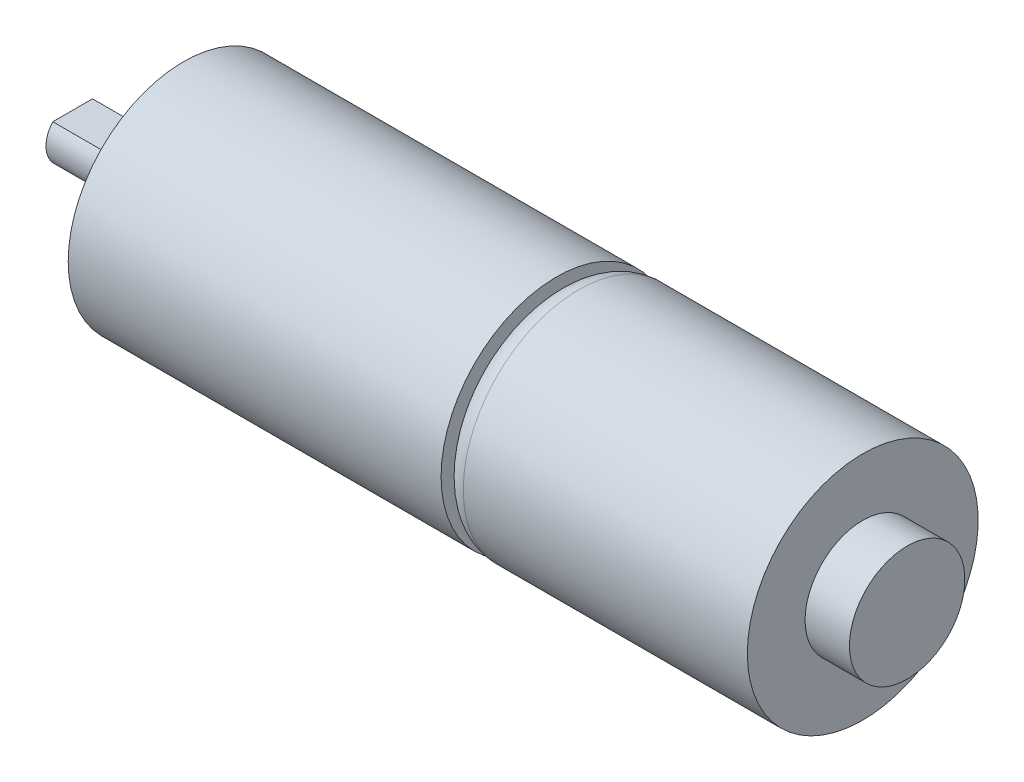
ISO-10303-21;
HEADER;
FILE_DESCRIPTION(('STEP AP214'),'2;1');
FILE_NAME('part.step','',(''),(''),'','','');
FILE_SCHEMA(('AUTOMOTIVE_DESIGN { 1 0 10303 214 1 1 1 1 }'));
ENDSEC;
DATA;
#1=APPLICATION_CONTEXT('core data for automotive mechanical design processes');
#2=APPLICATION_PROTOCOL_DEFINITION('international standard','automotive_design',2000,#1);
#3=PRODUCT_CONTEXT('',#1,'mechanical');
#4=PRODUCT('Part','Part','',(#3));
#5=PRODUCT_RELATED_PRODUCT_CATEGORY('part','',(#4));
#6=PRODUCT_DEFINITION_FORMATION('','',#4);
#7=PRODUCT_DEFINITION_CONTEXT('part definition',#1,'design');
#8=PRODUCT_DEFINITION('design','',#6,#7);
#9=PRODUCT_DEFINITION_SHAPE('','',#8);
#10=(LENGTH_UNIT() NAMED_UNIT(*) SI_UNIT(.MILLI.,.METRE.));
#11=(NAMED_UNIT(*) PLANE_ANGLE_UNIT() SI_UNIT($,.RADIAN.));
#12=(NAMED_UNIT(*) SI_UNIT($,.STERADIAN.) SOLID_ANGLE_UNIT());
#13=UNCERTAINTY_MEASURE_WITH_UNIT(LENGTH_MEASURE(1.E-05),#10,'distance_accuracy_value','');
#14=(GEOMETRIC_REPRESENTATION_CONTEXT(3) GLOBAL_UNCERTAINTY_ASSIGNED_CONTEXT((#13)) GLOBAL_UNIT_ASSIGNED_CONTEXT((#10,
#11,#12)) REPRESENTATION_CONTEXT('',''));
#15=CARTESIAN_POINT('',(0.,0.,0.));
#16=DIRECTION('',(0.,0.,1.));
#17=DIRECTION('',(1.,0.,0.));
#18=AXIS2_PLACEMENT_3D('',#15,#16,#17);
#19=CARTESIAN_POINT('',(-188.,0.,0.));
#20=DIRECTION('',(1.,0.,0.));
#21=DIRECTION('',(0.,0.,-1.));
#22=AXIS2_PLACEMENT_3D('',#19,#20,#21);
#23=PLANE('',#22);
#24=CARTESIAN_POINT('',(-188.,0.,0.));
#25=DIRECTION('',(-1.,0.,0.));
#26=DIRECTION('',(0.,0.,1.));
#27=AXIS2_PLACEMENT_3D('',#24,#25,#26);
#28=CIRCLE('',#27,6.);
#29=CARTESIAN_POINT('',(-188.,4.,-4.47213595499959));
#30=VERTEX_POINT('',#29);
#31=CARTESIAN_POINT('',(-188.,4.,4.47213595499957));
#32=VERTEX_POINT('',#31);
#33=EDGE_CURVE('E105',#30,#32,#28,.T.);
#34=ORIENTED_EDGE('',*,*,#33,.T.);
#35=DIRECTION('',(0.,0.,1.));
#36=VECTOR('',#35,1.);
#37=CARTESIAN_POINT('',(-188.,4.,-26.));
#38=LINE('',#37,#36);
#39=EDGE_CURVE('E52',#30,#32,#38,.T.);
#40=ORIENTED_EDGE('',*,*,#39,.F.);
#41=EDGE_LOOP('',(#34,#40));
#42=FACE_BOUND('',#41,.T.);
#43=ADVANCED_FACE('F31',(#42),#23,.F.);
#44=CARTESIAN_POINT('',(-188.,0.,0.));
#45=DIRECTION('',(-1.,0.,0.));
#46=DIRECTION('',(0.,0.,1.));
#47=AXIS2_PLACEMENT_3D('',#44,#45,#46);
#48=CYLINDRICAL_SURFACE('',#47,6.);
#49=CARTESIAN_POINT('',(-173.,0.,0.));
#50=DIRECTION('',(1.,0.,0.));
#51=DIRECTION('',(0.,0.,-1.));
#52=AXIS2_PLACEMENT_3D('',#49,#50,#51);
#53=CIRCLE('',#52,6.);
#54=CARTESIAN_POINT('',(-173.,4.,-4.47213595499958));
#55=VERTEX_POINT('',#54);
#56=CARTESIAN_POINT('',(-173.,4.,4.47213595499957));
#57=VERTEX_POINT('',#56);
#58=EDGE_CURVE('E39',#55,#57,#53,.T.);
#59=ORIENTED_EDGE('',*,*,#58,.T.);
#60=DIRECTION('',(-1.,0.,0.));
#61=VECTOR('',#60,1.);
#62=CARTESIAN_POINT('',(-188.,4.,4.47213595499958));
#63=LINE('',#62,#61);
#64=EDGE_CURVE('E11',#57,#32,#63,.T.);
#65=ORIENTED_EDGE('',*,*,#64,.T.);
#66=ORIENTED_EDGE('',*,*,#33,.F.);
#67=DIRECTION('',(-1.,0.,0.));
#68=VECTOR('',#67,1.);
#69=CARTESIAN_POINT('',(-188.,4.,-4.47213595499958));
#70=LINE('',#69,#68);
#71=EDGE_CURVE('E63',#30,#55,#70,.F.);
#72=ORIENTED_EDGE('',*,*,#71,.T.);
#73=EDGE_LOOP('',(#59,#65,#66,#72));
#74=FACE_BOUND('',#73,.T.);
#75=CARTESIAN_POINT('',(-166.,0.,0.));
#76=DIRECTION('',(-1.,0.,0.));
#77=DIRECTION('',(0.,0.,1.));
#78=AXIS2_PLACEMENT_3D('',#75,#76,#77);
#79=CIRCLE('',#78,6.);
#80=CARTESIAN_POINT('',(-166.,0.,6.));
#81=VERTEX_POINT('',#80);
#82=EDGE_CURVE('E102',#81,#81,#79,.T.);
#83=ORIENTED_EDGE('',*,*,#82,.T.);
#84=EDGE_LOOP('',(#83));
#85=FACE_BOUND('',#84,.T.);
#86=ADVANCED_FACE('F59',(#74,#85),#48,.T.);
#87=CARTESIAN_POINT('',(-166.,16.,0.));
#88=DIRECTION('',(1.,0.,0.));
#89=DIRECTION('',(0.,0.,-1.));
#90=AXIS2_PLACEMENT_3D('',#87,#88,#89);
#91=PLANE('',#90);
#92=ORIENTED_EDGE('',*,*,#82,.F.);
#93=EDGE_LOOP('',(#92));
#94=FACE_BOUND('',#93,.T.);
#95=CARTESIAN_POINT('',(-166.,0.,0.));
#96=DIRECTION('',(-1.,0.,0.));
#97=DIRECTION('',(0.,0.,1.));
#98=AXIS2_PLACEMENT_3D('',#95,#96,#97);
#99=CIRCLE('',#98,16.);
#100=CARTESIAN_POINT('',(-166.,0.,16.));
#101=VERTEX_POINT('',#100);
#102=EDGE_CURVE('E99',#101,#101,#99,.T.);
#103=ORIENTED_EDGE('',*,*,#102,.T.);
#104=EDGE_LOOP('',(#103));
#105=FACE_BOUND('',#104,.T.);
#106=ADVANCED_FACE('F200',(#94,#105),#91,.F.);
#107=CARTESIAN_POINT('',(-188.,0.,0.));
#108=DIRECTION('',(-1.,0.,0.));
#109=DIRECTION('',(0.,0.,1.));
#110=AXIS2_PLACEMENT_3D('',#107,#108,#109);
#111=CYLINDRICAL_SURFACE('',#110,16.);
#112=ORIENTED_EDGE('',*,*,#102,.F.);
#113=EDGE_LOOP('',(#112));
#114=FACE_BOUND('',#113,.T.);
#115=CARTESIAN_POINT('',(-163.,0.,0.));
#116=DIRECTION('',(-1.,0.,0.));
#117=DIRECTION('',(0.,0.,1.));
#118=AXIS2_PLACEMENT_3D('',#115,#116,#117);
#119=CIRCLE('',#118,16.);
#120=CARTESIAN_POINT('',(-163.,0.,16.));
#121=VERTEX_POINT('',#120);
#122=EDGE_CURVE('E96',#121,#121,#119,.T.);
#123=ORIENTED_EDGE('',*,*,#122,.T.);
#124=EDGE_LOOP('',(#123));
#125=FACE_BOUND('',#124,.T.);
#126=ADVANCED_FACE('F141',(#114,#125),#111,.T.);
#127=CARTESIAN_POINT('',(-163.,16.,0.));
#128=DIRECTION('',(1.,0.,0.));
#129=DIRECTION('',(0.,0.,-1.));
#130=AXIS2_PLACEMENT_3D('',#127,#128,#129);
#131=PLANE('',#130);
#132=CARTESIAN_POINT('',(-163.,0.,-20.));
#133=DIRECTION('',(1.,0.,0.));
#134=DIRECTION('',(0.,0.,-1.));
#135=AXIS2_PLACEMENT_3D('',#132,#133,#134);
#136=CIRCLE('',#135,2.25);
#137=CARTESIAN_POINT('',(-163.,0.,-22.25));
#138=VERTEX_POINT('',#137);
#139=EDGE_CURVE('E34',#138,#138,#136,.T.);
#140=ORIENTED_EDGE('',*,*,#139,.T.);
#141=EDGE_LOOP('',(#140));
#142=FACE_BOUND('',#141,.T.);
#143=CARTESIAN_POINT('',(-163.,-20.,0.));
#144=DIRECTION('',(1.,0.,0.));
#145=DIRECTION('',(0.,0.,-1.));
#146=AXIS2_PLACEMENT_3D('',#143,#144,#145);
#147=CIRCLE('',#146,2.25);
#148=CARTESIAN_POINT('',(-163.,-20.,-2.25));
#149=VERTEX_POINT('',#148);
#150=EDGE_CURVE('E113',#149,#149,#147,.T.);
#151=ORIENTED_EDGE('',*,*,#150,.T.);
#152=EDGE_LOOP('',(#151));
#153=FACE_BOUND('',#152,.T.);
#154=CARTESIAN_POINT('',(-163.,0.,20.));
#155=DIRECTION('',(1.,0.,0.));
#156=DIRECTION('',(0.,0.,-1.));
#157=AXIS2_PLACEMENT_3D('',#154,#155,#156);
#158=CIRCLE('',#157,2.25);
#159=CARTESIAN_POINT('',(-163.,0.,17.75));
#160=VERTEX_POINT('',#159);
#161=EDGE_CURVE('E110',#160,#160,#158,.T.);
#162=ORIENTED_EDGE('',*,*,#161,.T.);
#163=EDGE_LOOP('',(#162));
#164=FACE_BOUND('',#163,.T.);
#165=CARTESIAN_POINT('',(-163.,20.,0.));
#166=DIRECTION('',(1.,0.,0.));
#167=DIRECTION('',(0.,0.,-1.));
#168=AXIS2_PLACEMENT_3D('',#165,#166,#167);
#169=CIRCLE('',#168,2.25);
#170=CARTESIAN_POINT('',(-163.,20.,-2.25));
#171=VERTEX_POINT('',#170);
#172=EDGE_CURVE('E73',#171,#171,#169,.T.);
#173=ORIENTED_EDGE('',*,*,#172,.T.);
#174=EDGE_LOOP('',(#173));
#175=FACE_BOUND('',#174,.T.);
#176=ORIENTED_EDGE('',*,*,#122,.F.);
#177=EDGE_LOOP('',(#176));
#178=FACE_BOUND('',#177,.T.);
#179=CARTESIAN_POINT('',(-163.,0.,0.));
#180=DIRECTION('',(-1.,0.,0.));
#181=DIRECTION('',(0.,0.,1.));
#182=AXIS2_PLACEMENT_3D('',#179,#180,#181);
#183=CIRCLE('',#182,26.);
#184=CARTESIAN_POINT('',(-163.,0.,26.));
#185=VERTEX_POINT('',#184);
#186=EDGE_CURVE('E93',#185,#185,#183,.T.);
#187=ORIENTED_EDGE('',*,*,#186,.T.);
#188=EDGE_LOOP('',(#187));
#189=FACE_BOUND('',#188,.T.);
#190=ADVANCED_FACE('F138',(#142,#153,#164,#175,#178,#189),#131,.F.);
#191=CARTESIAN_POINT('',(-188.,0.,0.));
#192=DIRECTION('',(-1.,0.,0.));
#193=DIRECTION('',(0.,0.,1.));
#194=AXIS2_PLACEMENT_3D('',#191,#192,#193);
#195=CYLINDRICAL_SURFACE('',#194,26.);
#196=ORIENTED_EDGE('',*,*,#186,.F.);
#197=EDGE_LOOP('',(#196));
#198=FACE_BOUND('',#197,.T.);
#199=CARTESIAN_POINT('',(-79.,0.,0.));
#200=DIRECTION('',(-1.,0.,0.));
#201=DIRECTION('',(0.,0.,1.));
#202=AXIS2_PLACEMENT_3D('',#199,#200,#201);
#203=CIRCLE('',#202,26.);
#204=CARTESIAN_POINT('',(-79.,0.,26.));
#205=VERTEX_POINT('',#204);
#206=EDGE_CURVE('E90',#205,#205,#203,.T.);
#207=ORIENTED_EDGE('',*,*,#206,.T.);
#208=EDGE_LOOP('',(#207));
#209=FACE_BOUND('',#208,.T.);
#210=ADVANCED_FACE('F140',(#198,#209),#195,.T.);
#211=CARTESIAN_POINT('',(-79.,26.,0.));
#212=DIRECTION('',(-1.,0.,0.));
#213=DIRECTION('',(0.,0.,1.));
#214=AXIS2_PLACEMENT_3D('',#211,#212,#213);
#215=PLANE('',#214);
#216=ORIENTED_EDGE('',*,*,#206,.F.);
#217=EDGE_LOOP('',(#216));
#218=FACE_BOUND('',#217,.T.);
#219=CARTESIAN_POINT('',(-79.,0.,0.));
#220=DIRECTION('',(-1.,0.,0.));
#221=DIRECTION('',(0.,0.,1.));
#222=AXIS2_PLACEMENT_3D('',#219,#220,#221);
#223=CIRCLE('',#222,21.);
#224=CARTESIAN_POINT('',(-79.,0.,21.));
#225=VERTEX_POINT('',#224);
#226=EDGE_CURVE('E87',#225,#225,#223,.T.);
#227=ORIENTED_EDGE('',*,*,#226,.T.);
#228=EDGE_LOOP('',(#227));
#229=FACE_BOUND('',#228,.T.);
#230=ADVANCED_FACE('F154',(#218,#229),#215,.F.);
#231=CARTESIAN_POINT('',(-74.,0.,0.));
#232=DIRECTION('',(-1.,0.,0.));
#233=DIRECTION('',(0.,0.,1.));
#234=AXIS2_PLACEMENT_3D('',#231,#232,#233);
#235=TOROIDAL_SURFACE('',#234,21.,5.);
#236=ORIENTED_EDGE('',*,*,#226,.F.);
#237=EDGE_LOOP('',(#236));
#238=FACE_BOUND('',#237,.T.);
#239=CARTESIAN_POINT('',(-74.,0.,0.));
#240=DIRECTION('',(-1.,0.,0.));
#241=DIRECTION('',(0.,0.,1.));
#242=AXIS2_PLACEMENT_3D('',#239,#240,#241);
#243=CIRCLE('',#242,26.);
#244=CARTESIAN_POINT('',(-74.,0.,26.));
#245=VERTEX_POINT('',#244);
#246=EDGE_CURVE('E84',#245,#245,#243,.T.);
#247=ORIENTED_EDGE('',*,*,#246,.T.);
#248=EDGE_LOOP('',(#247));
#249=FACE_BOUND('',#248,.T.);
#250=ADVANCED_FACE('F160',(#238,#249),#235,.T.);
#251=CARTESIAN_POINT('',(-188.,0.,0.));
#252=DIRECTION('',(-1.,0.,0.));
#253=DIRECTION('',(0.,0.,1.));
#254=AXIS2_PLACEMENT_3D('',#251,#252,#253);
#255=CYLINDRICAL_SURFACE('',#254,26.);
#256=ORIENTED_EDGE('',*,*,#246,.F.);
#257=EDGE_LOOP('',(#256));
#258=FACE_BOUND('',#257,.T.);
#259=CARTESIAN_POINT('',(-10.,0.,0.));
#260=DIRECTION('',(-1.,0.,0.));
#261=DIRECTION('',(0.,0.,1.));
#262=AXIS2_PLACEMENT_3D('',#259,#260,#261);
#263=CIRCLE('',#262,26.);
#264=CARTESIAN_POINT('',(-10.,0.,26.));
#265=VERTEX_POINT('',#264);
#266=EDGE_CURVE('E81',#265,#265,#263,.T.);
#267=ORIENTED_EDGE('',*,*,#266,.T.);
#268=EDGE_LOOP('',(#267));
#269=FACE_BOUND('',#268,.T.);
#270=ADVANCED_FACE('F166',(#258,#269),#255,.T.);
#271=CARTESIAN_POINT('',(-10.,26.,0.));
#272=DIRECTION('',(-1.,0.,0.));
#273=DIRECTION('',(0.,0.,1.));
#274=AXIS2_PLACEMENT_3D('',#271,#272,#273);
#275=PLANE('',#274);
#276=ORIENTED_EDGE('',*,*,#266,.F.);
#277=EDGE_LOOP('',(#276));
#278=FACE_BOUND('',#277,.T.);
#279=CARTESIAN_POINT('',(-10.,0.,0.));
#280=DIRECTION('',(-1.,0.,0.));
#281=DIRECTION('',(0.,0.,1.));
#282=AXIS2_PLACEMENT_3D('',#279,#280,#281);
#283=CIRCLE('',#282,13.);
#284=CARTESIAN_POINT('',(-10.,0.,13.));
#285=VERTEX_POINT('',#284);
#286=EDGE_CURVE('E71',#285,#285,#283,.T.);
#287=ORIENTED_EDGE('',*,*,#286,.T.);
#288=EDGE_LOOP('',(#287));
#289=FACE_BOUND('',#288,.T.);
#290=ADVANCED_FACE('F172',(#278,#289),#275,.F.);
#291=CARTESIAN_POINT('',(-188.,0.,0.));
#292=DIRECTION('',(-1.,0.,0.));
#293=DIRECTION('',(0.,0.,1.));
#294=AXIS2_PLACEMENT_3D('',#291,#292,#293);
#295=CYLINDRICAL_SURFACE('',#294,13.);
#296=ORIENTED_EDGE('',*,*,#286,.F.);
#297=EDGE_LOOP('',(#296));
#298=FACE_BOUND('',#297,.T.);
#299=CARTESIAN_POINT('',(0.,0.,0.));
#300=DIRECTION('',(-1.,0.,0.));
#301=DIRECTION('',(0.,0.,1.));
#302=AXIS2_PLACEMENT_3D('',#299,#300,#301);
#303=CIRCLE('',#302,13.);
#304=CARTESIAN_POINT('',(0.,0.,13.));
#305=VERTEX_POINT('',#304);
#306=EDGE_CURVE('E68',#305,#305,#303,.T.);
#307=ORIENTED_EDGE('',*,*,#306,.T.);
#308=EDGE_LOOP('',(#307));
#309=FACE_BOUND('',#308,.T.);
#310=ADVANCED_FACE('F178',(#298,#309),#295,.T.);
#311=CARTESIAN_POINT('',(0.,13.,0.));
#312=DIRECTION('',(-1.,0.,0.));
#313=DIRECTION('',(0.,0.,1.));
#314=AXIS2_PLACEMENT_3D('',#311,#312,#313);
#315=PLANE('',#314);
#316=ORIENTED_EDGE('',*,*,#306,.F.);
#317=EDGE_LOOP('',(#316));
#318=FACE_BOUND('',#317,.T.);
#319=ADVANCED_FACE('F184',(#318),#315,.F.);
#320=CARTESIAN_POINT('',(-173.,6.,-26.));
#321=DIRECTION('',(1.,0.,0.));
#322=DIRECTION('',(0.,0.,-1.));
#323=AXIS2_PLACEMENT_3D('',#320,#321,#322);
#324=PLANE('',#323);
#325=DIRECTION('',(0.,0.,1.));
#326=VECTOR('',#325,1.);
#327=CARTESIAN_POINT('',(-173.,4.,-26.));
#328=LINE('',#327,#326);
#329=EDGE_CURVE('E47',#55,#57,#328,.T.);
#330=ORIENTED_EDGE('',*,*,#329,.T.);
#331=ORIENTED_EDGE('',*,*,#58,.F.);
#332=EDGE_LOOP('',(#330,#331));
#333=FACE_BOUND('',#332,.T.);
#334=ADVANCED_FACE('F67',(#333),#324,.F.);
#335=CARTESIAN_POINT('',(-188.,4.,-26.));
#336=DIRECTION('',(0.,-1.,0.));
#337=DIRECTION('',(0.,0.,-1.));
#338=AXIS2_PLACEMENT_3D('',#335,#336,#337);
#339=PLANE('',#338);
#340=ORIENTED_EDGE('',*,*,#329,.F.);
#341=ORIENTED_EDGE('',*,*,#71,.F.);
#342=ORIENTED_EDGE('',*,*,#39,.T.);
#343=ORIENTED_EDGE('',*,*,#64,.F.);
#344=EDGE_LOOP('',(#340,#341,#342,#343));
#345=FACE_BOUND('',#344,.T.);
#346=ADVANCED_FACE('F66',(#345),#339,.F.);
#347=CARTESIAN_POINT('',(-156.,20.,0.));
#348=DIRECTION('',(-1.,0.,0.));
#349=DIRECTION('',(0.,0.,1.));
#350=AXIS2_PLACEMENT_3D('',#347,#348,#349);
#351=CYLINDRICAL_SURFACE('',#350,2.25);
#352=CARTESIAN_POINT('',(-156.,20.,0.));
#353=DIRECTION('',(-1.,0.,0.));
#354=DIRECTION('',(0.,0.,1.));
#355=AXIS2_PLACEMENT_3D('',#352,#353,#354);
#356=CIRCLE('',#355,2.25);
#357=CARTESIAN_POINT('',(-156.,20.,2.25));
#358=VERTEX_POINT('',#357);
#359=EDGE_CURVE('E76',#358,#358,#356,.T.);
#360=ORIENTED_EDGE('',*,*,#359,.F.);
#361=EDGE_LOOP('',(#360));
#362=FACE_BOUND('',#361,.T.);
#363=ORIENTED_EDGE('',*,*,#172,.F.);
#364=EDGE_LOOP('',(#363));
#365=FACE_BOUND('',#364,.T.);
#366=ADVANCED_FACE('F272',(#362,#365),#351,.F.);
#367=CARTESIAN_POINT('',(-156.,20.,0.));
#368=DIRECTION('',(-1.,0.,0.));
#369=DIRECTION('',(0.,0.,1.));
#370=AXIS2_PLACEMENT_3D('',#367,#368,#369);
#371=PLANE('',#370);
#372=ORIENTED_EDGE('',*,*,#359,.T.);
#373=EDGE_LOOP('',(#372));
#374=FACE_BOUND('',#373,.T.);
#375=ADVANCED_FACE('F280',(#374),#371,.T.);
#376=CARTESIAN_POINT('',(-156.,0.,20.));
#377=DIRECTION('',(-1.,0.,0.));
#378=DIRECTION('',(0.,0.,1.));
#379=AXIS2_PLACEMENT_3D('',#376,#377,#378);
#380=CYLINDRICAL_SURFACE('',#379,2.25);
#381=CARTESIAN_POINT('',(-156.,0.,20.));
#382=DIRECTION('',(-1.,0.,0.));
#383=DIRECTION('',(0.,0.,1.));
#384=AXIS2_PLACEMENT_3D('',#381,#382,#383);
#385=CIRCLE('',#384,2.25);
#386=CARTESIAN_POINT('',(-156.,0.,22.25));
#387=VERTEX_POINT('',#386);
#388=EDGE_CURVE('E112',#387,#387,#385,.T.);
#389=ORIENTED_EDGE('',*,*,#388,.F.);
#390=EDGE_LOOP('',(#389));
#391=FACE_BOUND('',#390,.T.);
#392=ORIENTED_EDGE('',*,*,#161,.F.);
#393=EDGE_LOOP('',(#392));
#394=FACE_BOUND('',#393,.T.);
#395=ADVANCED_FACE('F287',(#391,#394),#380,.F.);
#396=CARTESIAN_POINT('',(-156.,0.,20.));
#397=DIRECTION('',(-1.,0.,0.));
#398=DIRECTION('',(0.,0.,1.));
#399=AXIS2_PLACEMENT_3D('',#396,#397,#398);
#400=PLANE('',#399);
#401=ORIENTED_EDGE('',*,*,#388,.T.);
#402=EDGE_LOOP('',(#401));
#403=FACE_BOUND('',#402,.T.);
#404=ADVANCED_FACE('F295',(#403),#400,.T.);
#405=CARTESIAN_POINT('',(-156.,-20.,0.));
#406=DIRECTION('',(-1.,0.,0.));
#407=DIRECTION('',(0.,0.,1.));
#408=AXIS2_PLACEMENT_3D('',#405,#406,#407);
#409=CYLINDRICAL_SURFACE('',#408,2.25);
#410=CARTESIAN_POINT('',(-156.,-20.,0.));
#411=DIRECTION('',(-1.,0.,0.));
#412=DIRECTION('',(0.,0.,1.));
#413=AXIS2_PLACEMENT_3D('',#410,#411,#412);
#414=CIRCLE('',#413,2.25);
#415=CARTESIAN_POINT('',(-156.,-20.,2.25));
#416=VERTEX_POINT('',#415);
#417=EDGE_CURVE('E115',#416,#416,#414,.T.);
#418=ORIENTED_EDGE('',*,*,#417,.F.);
#419=EDGE_LOOP('',(#418));
#420=FACE_BOUND('',#419,.T.);
#421=ORIENTED_EDGE('',*,*,#150,.F.);
#422=EDGE_LOOP('',(#421));
#423=FACE_BOUND('',#422,.T.);
#424=ADVANCED_FACE('F303',(#420,#423),#409,.F.);
#425=CARTESIAN_POINT('',(-156.,-20.,0.));
#426=DIRECTION('',(-1.,0.,0.));
#427=DIRECTION('',(0.,0.,1.));
#428=AXIS2_PLACEMENT_3D('',#425,#426,#427);
#429=PLANE('',#428);
#430=ORIENTED_EDGE('',*,*,#417,.T.);
#431=EDGE_LOOP('',(#430));
#432=FACE_BOUND('',#431,.T.);
#433=ADVANCED_FACE('F134',(#432),#429,.T.);
#434=CARTESIAN_POINT('',(-156.,0.,-20.));
#435=DIRECTION('',(-1.,0.,0.));
#436=DIRECTION('',(0.,0.,1.));
#437=AXIS2_PLACEMENT_3D('',#434,#435,#436);
#438=CYLINDRICAL_SURFACE('',#437,2.25);
#439=CARTESIAN_POINT('',(-156.,0.,-20.));
#440=DIRECTION('',(-1.,0.,0.));
#441=DIRECTION('',(0.,0.,1.));
#442=AXIS2_PLACEMENT_3D('',#439,#440,#441);
#443=CIRCLE('',#442,2.25);
#444=CARTESIAN_POINT('',(-156.,0.,-17.75));
#445=VERTEX_POINT('',#444);
#446=EDGE_CURVE('E124',#445,#445,#443,.T.);
#447=ORIENTED_EDGE('',*,*,#446,.F.);
#448=EDGE_LOOP('',(#447));
#449=FACE_BOUND('',#448,.T.);
#450=ORIENTED_EDGE('',*,*,#139,.F.);
#451=EDGE_LOOP('',(#450));
#452=FACE_BOUND('',#451,.T.);
#453=ADVANCED_FACE('F131',(#449,#452),#438,.F.);
#454=CARTESIAN_POINT('',(-156.,0.,-20.));
#455=DIRECTION('',(-1.,0.,0.));
#456=DIRECTION('',(0.,0.,1.));
#457=AXIS2_PLACEMENT_3D('',#454,#455,#456);
#458=PLANE('',#457);
#459=ORIENTED_EDGE('',*,*,#446,.T.);
#460=EDGE_LOOP('',(#459));
#461=FACE_BOUND('',#460,.T.);
#462=ADVANCED_FACE('F129',(#461),#458,.T.);
#463=CLOSED_SHELL('',(#43,#86,#106,#126,#190,#210,#230,#250,#270,#290,#310,#319,#334,#346,#366,
#375,#395,#404,#424,#433,#453,#462));
#464=MANIFOLD_SOLID_BREP('B2',#463);
#465=ADVANCED_BREP_SHAPE_REPRESENTATION('',(#18,#464),#14);
#466=SHAPE_DEFINITION_REPRESENTATION(#9,#465);
ENDSEC;
END-ISO-10303-21;
